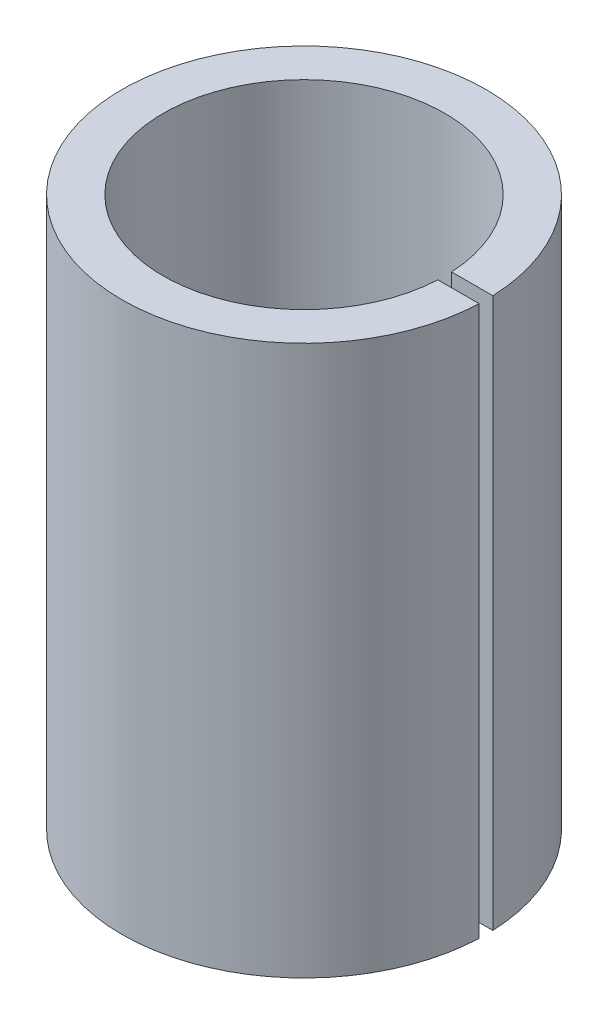
ISO-10303-21;
HEADER;
FILE_DESCRIPTION(('STEP AP214'),'2;1');
FILE_NAME('part.step','',(''),(''),'','','');
FILE_SCHEMA(('AUTOMOTIVE_DESIGN { 1 0 10303 214 1 1 1 1 }'));
ENDSEC;
DATA;
#1=APPLICATION_CONTEXT('core data for automotive mechanical design processes');
#2=APPLICATION_PROTOCOL_DEFINITION('international standard','automotive_design',2000,#1);
#3=PRODUCT_CONTEXT('',#1,'mechanical');
#4=PRODUCT('Part','Part','',(#3));
#5=PRODUCT_RELATED_PRODUCT_CATEGORY('part','',(#4));
#6=PRODUCT_DEFINITION_FORMATION('','',#4);
#7=PRODUCT_DEFINITION_CONTEXT('part definition',#1,'design');
#8=PRODUCT_DEFINITION('design','',#6,#7);
#9=PRODUCT_DEFINITION_SHAPE('','',#8);
#10=(LENGTH_UNIT() NAMED_UNIT(*) SI_UNIT(.MILLI.,.METRE.));
#11=(NAMED_UNIT(*) PLANE_ANGLE_UNIT() SI_UNIT($,.RADIAN.));
#12=(NAMED_UNIT(*) SI_UNIT($,.STERADIAN.) SOLID_ANGLE_UNIT());
#13=UNCERTAINTY_MEASURE_WITH_UNIT(LENGTH_MEASURE(1.E-05),#10,'distance_accuracy_value','');
#14=(GEOMETRIC_REPRESENTATION_CONTEXT(3) GLOBAL_UNCERTAINTY_ASSIGNED_CONTEXT((#13)) GLOBAL_UNIT_ASSIGNED_CONTEXT((#10,
#11,#12)) REPRESENTATION_CONTEXT('',''));
#15=CARTESIAN_POINT('',(0.,0.,0.));
#16=DIRECTION('',(0.,0.,1.));
#17=DIRECTION('',(1.,0.,0.));
#18=AXIS2_PLACEMENT_3D('',#15,#16,#17);
#19=CARTESIAN_POINT('',(0.,8.,0.));
#20=DIRECTION('',(0.,1.,0.));
#21=DIRECTION('',(0.,0.,1.));
#22=AXIS2_PLACEMENT_3D('',#19,#20,#21);
#23=PLANE('',#22);
#24=DIRECTION('',(-1.,0.,0.));
#25=VECTOR('',#24,1.);
#26=CARTESIAN_POINT('',(2.04755952294432,8.,-0.1));
#27=LINE('',#26,#25);
#28=CARTESIAN_POINT('',(2.64811253537307,8.,-0.1));
#29=VERTEX_POINT('',#28);
#30=CARTESIAN_POINT('',(2.04755952294432,8.,-0.1));
#31=VERTEX_POINT('',#30);
#32=EDGE_CURVE('E42',#29,#31,#27,.T.);
#33=ORIENTED_EDGE('',*,*,#32,.F.);
#34=CARTESIAN_POINT('',(0.,8.,0.));
#35=DIRECTION('',(0.,1.,0.));
#36=DIRECTION('',(0.,0.,1.));
#37=AXIS2_PLACEMENT_3D('',#34,#35,#36);
#38=CIRCLE('',#37,2.65);
#39=CARTESIAN_POINT('',(2.64811253537307,8.,0.1));
#40=VERTEX_POINT('',#39);
#41=EDGE_CURVE('E11',#29,#40,#38,.T.);
#42=ORIENTED_EDGE('',*,*,#41,.T.);
#43=DIRECTION('',(1.,0.,0.));
#44=VECTOR('',#43,1.);
#45=CARTESIAN_POINT('',(2.04755952294432,8.,0.1));
#46=LINE('',#45,#44);
#47=CARTESIAN_POINT('',(2.04755952294432,8.,0.1));
#48=VERTEX_POINT('',#47);
#49=EDGE_CURVE('E96',#48,#40,#46,.T.);
#50=ORIENTED_EDGE('',*,*,#49,.F.);
#51=CARTESIAN_POINT('',(0.,8.,0.));
#52=DIRECTION('',(0.,1.,0.));
#53=DIRECTION('',(0.,0.,1.));
#54=AXIS2_PLACEMENT_3D('',#51,#52,#53);
#55=CIRCLE('',#54,2.05);
#56=EDGE_CURVE('E77',#31,#48,#55,.T.);
#57=ORIENTED_EDGE('',*,*,#56,.F.);
#58=EDGE_LOOP('',(#33,#42,#50,#57));
#59=FACE_BOUND('',#58,.T.);
#60=ADVANCED_FACE('F17',(#59),#23,.T.);
#61=CARTESIAN_POINT('',(0.,0.,0.));
#62=DIRECTION('',(0.,1.,0.));
#63=DIRECTION('',(0.,0.,1.));
#64=AXIS2_PLACEMENT_3D('',#61,#62,#63);
#65=PLANE('',#64);
#66=CARTESIAN_POINT('',(0.,0.,0.));
#67=DIRECTION('',(0.,1.,0.));
#68=DIRECTION('',(0.,0.,1.));
#69=AXIS2_PLACEMENT_3D('',#66,#67,#68);
#70=CIRCLE('',#69,2.65);
#71=CARTESIAN_POINT('',(2.64811253537307,0.,-0.1));
#72=VERTEX_POINT('',#71);
#73=CARTESIAN_POINT('',(2.64811253537307,0.,0.1));
#74=VERTEX_POINT('',#73);
#75=EDGE_CURVE('E26',#72,#74,#70,.T.);
#76=ORIENTED_EDGE('',*,*,#75,.F.);
#77=DIRECTION('',(-1.,0.,0.));
#78=VECTOR('',#77,1.);
#79=CARTESIAN_POINT('',(2.04755952294432,0.,-0.1));
#80=LINE('',#79,#78);
#81=CARTESIAN_POINT('',(2.04755952294432,0.,-0.1));
#82=VERTEX_POINT('',#81);
#83=EDGE_CURVE('E60',#72,#82,#80,.T.);
#84=ORIENTED_EDGE('',*,*,#83,.T.);
#85=CARTESIAN_POINT('',(0.,0.,0.));
#86=DIRECTION('',(0.,1.,0.));
#87=DIRECTION('',(0.,0.,1.));
#88=AXIS2_PLACEMENT_3D('',#85,#86,#87);
#89=CIRCLE('',#88,2.05);
#90=CARTESIAN_POINT('',(2.04755952294432,0.,0.1));
#91=VERTEX_POINT('',#90);
#92=EDGE_CURVE('E73',#82,#91,#89,.T.);
#93=ORIENTED_EDGE('',*,*,#92,.T.);
#94=DIRECTION('',(1.,0.,0.));
#95=VECTOR('',#94,1.);
#96=CARTESIAN_POINT('',(2.04755952294432,0.,0.1));
#97=LINE('',#96,#95);
#98=EDGE_CURVE('E34',#91,#74,#97,.T.);
#99=ORIENTED_EDGE('',*,*,#98,.T.);
#100=EDGE_LOOP('',(#76,#84,#93,#99));
#101=FACE_BOUND('',#100,.T.);
#102=ADVANCED_FACE('F72',(#101),#65,.F.);
#103=CARTESIAN_POINT('',(0.,8.,0.));
#104=DIRECTION('',(0.,-1.,0.));
#105=DIRECTION('',(0.,0.,-1.));
#106=AXIS2_PLACEMENT_3D('',#103,#104,#105);
#107=CYLINDRICAL_SURFACE('',#106,2.65);
#108=ORIENTED_EDGE('',*,*,#41,.F.);
#109=DIRECTION('',(0.,-1.,0.));
#110=VECTOR('',#109,1.);
#111=CARTESIAN_POINT('',(2.64811253537307,8.,-0.1));
#112=LINE('',#111,#110);
#113=EDGE_CURVE('E78',#29,#72,#112,.T.);
#114=ORIENTED_EDGE('',*,*,#113,.T.);
#115=ORIENTED_EDGE('',*,*,#75,.T.);
#116=DIRECTION('',(0.,-1.,0.));
#117=VECTOR('',#116,1.);
#118=CARTESIAN_POINT('',(2.64811253537307,8.,0.1));
#119=LINE('',#118,#117);
#120=EDGE_CURVE('E66',#74,#40,#119,.F.);
#121=ORIENTED_EDGE('',*,*,#120,.T.);
#122=EDGE_LOOP('',(#108,#114,#115,#121));
#123=FACE_BOUND('',#122,.T.);
#124=ADVANCED_FACE('F19',(#123),#107,.T.);
#125=CARTESIAN_POINT('',(0.,8.,0.));
#126=DIRECTION('',(0.,-1.,0.));
#127=DIRECTION('',(0.,0.,-1.));
#128=AXIS2_PLACEMENT_3D('',#125,#126,#127);
#129=CYLINDRICAL_SURFACE('',#128,2.05);
#130=DIRECTION('',(0.,1.,0.));
#131=VECTOR('',#130,1.);
#132=CARTESIAN_POINT('',(2.04755952294432,0.,-0.1));
#133=LINE('',#132,#131);
#134=EDGE_CURVE('E57',#82,#31,#133,.T.);
#135=ORIENTED_EDGE('',*,*,#134,.T.);
#136=ORIENTED_EDGE('',*,*,#56,.T.);
#137=DIRECTION('',(0.,1.,0.));
#138=VECTOR('',#137,1.);
#139=CARTESIAN_POINT('',(2.04755952294432,0.,0.1));
#140=LINE('',#139,#138);
#141=EDGE_CURVE('E67',#91,#48,#140,.T.);
#142=ORIENTED_EDGE('',*,*,#141,.F.);
#143=ORIENTED_EDGE('',*,*,#92,.F.);
#144=EDGE_LOOP('',(#135,#136,#142,#143));
#145=FACE_BOUND('',#144,.T.);
#146=ADVANCED_FACE('F76',(#145),#129,.F.);
#147=CARTESIAN_POINT('',(2.04755952294432,0.,0.1));
#148=DIRECTION('',(0.,0.,1.));
#149=DIRECTION('',(1.,0.,0.));
#150=AXIS2_PLACEMENT_3D('',#147,#148,#149);
#151=PLANE('',#150);
#152=ORIENTED_EDGE('',*,*,#98,.F.);
#153=ORIENTED_EDGE('',*,*,#141,.T.);
#154=ORIENTED_EDGE('',*,*,#49,.T.);
#155=ORIENTED_EDGE('',*,*,#120,.F.);
#156=EDGE_LOOP('',(#152,#153,#154,#155));
#157=FACE_BOUND('',#156,.T.);
#158=ADVANCED_FACE('F107',(#157),#151,.F.);
#159=CARTESIAN_POINT('',(2.04755952294432,0.,-0.1));
#160=DIRECTION('',(0.,0.,-1.));
#161=DIRECTION('',(-1.,0.,0.));
#162=AXIS2_PLACEMENT_3D('',#159,#160,#161);
#163=PLANE('',#162);
#164=ORIENTED_EDGE('',*,*,#32,.T.);
#165=ORIENTED_EDGE('',*,*,#134,.F.);
#166=ORIENTED_EDGE('',*,*,#83,.F.);
#167=ORIENTED_EDGE('',*,*,#113,.F.);
#168=EDGE_LOOP('',(#164,#165,#166,#167));
#169=FACE_BOUND('',#168,.T.);
#170=ADVANCED_FACE('F59',(#169),#163,.F.);
#171=CLOSED_SHELL('',(#60,#102,#124,#146,#158,#170));
#172=MANIFOLD_SOLID_BREP('B1',#171);
#173=ADVANCED_BREP_SHAPE_REPRESENTATION('',(#18,#172),#14);
#174=SHAPE_DEFINITION_REPRESENTATION(#9,#173);
ENDSEC;
END-ISO-10303-21;
